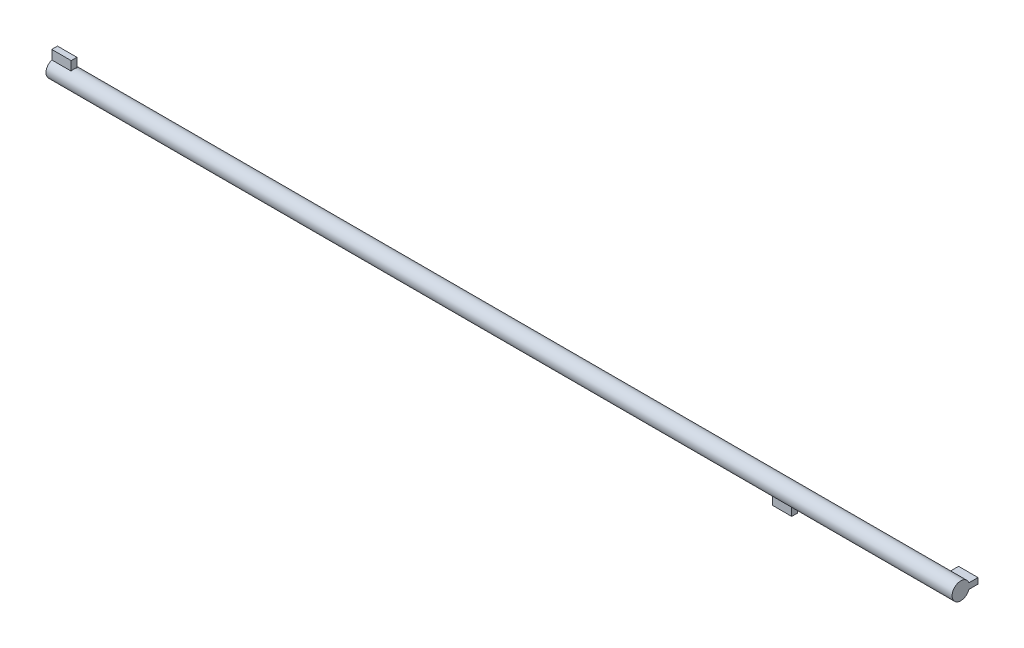
ISO-10303-21;
HEADER;
FILE_DESCRIPTION(('STEP AP214'),'2;1');
FILE_NAME('part.step','',(''),(''),'','','');
FILE_SCHEMA(('AUTOMOTIVE_DESIGN { 1 0 10303 214 1 1 1 1 }'));
ENDSEC;
DATA;
#1=APPLICATION_CONTEXT('core data for automotive mechanical design processes');
#2=APPLICATION_PROTOCOL_DEFINITION('international standard','automotive_design',2000,#1);
#3=PRODUCT_CONTEXT('',#1,'mechanical');
#4=PRODUCT('Part','Part','',(#3));
#5=PRODUCT_RELATED_PRODUCT_CATEGORY('part','',(#4));
#6=PRODUCT_DEFINITION_FORMATION('','',#4);
#7=PRODUCT_DEFINITION_CONTEXT('part definition',#1,'design');
#8=PRODUCT_DEFINITION('design','',#6,#7);
#9=PRODUCT_DEFINITION_SHAPE('','',#8);
#10=(LENGTH_UNIT() NAMED_UNIT(*) SI_UNIT(.MILLI.,.METRE.));
#11=(NAMED_UNIT(*) PLANE_ANGLE_UNIT() SI_UNIT($,.RADIAN.));
#12=(NAMED_UNIT(*) SI_UNIT($,.STERADIAN.) SOLID_ANGLE_UNIT());
#13=UNCERTAINTY_MEASURE_WITH_UNIT(LENGTH_MEASURE(1.E-05),#10,'distance_accuracy_value','');
#14=(GEOMETRIC_REPRESENTATION_CONTEXT(3) GLOBAL_UNCERTAINTY_ASSIGNED_CONTEXT((#13)) GLOBAL_UNIT_ASSIGNED_CONTEXT((#10,
#11,#12)) REPRESENTATION_CONTEXT('',''));
#15=CARTESIAN_POINT('',(0.,0.,0.));
#16=DIRECTION('',(0.,0.,1.));
#17=DIRECTION('',(1.,0.,0.));
#18=AXIS2_PLACEMENT_3D('',#15,#16,#17);
#19=CARTESIAN_POINT('',(-167.,0.,0.));
#20=DIRECTION('',(1.,0.,0.));
#21=DIRECTION('',(0.,0.,-1.));
#22=AXIS2_PLACEMENT_3D('',#19,#20,#21);
#23=CYLINDRICAL_SURFACE('',#22,2.);
#24=CARTESIAN_POINT('',(4.5,0.,0.));
#25=DIRECTION('',(1.,0.,0.));
#26=DIRECTION('',(0.,0.,-1.));
#27=AXIS2_PLACEMENT_3D('',#24,#25,#26);
#28=CIRCLE('',#27,2.);
#29=CARTESIAN_POINT('',(4.5,-1.88561808316413,-0.666666666666667));
#30=VERTEX_POINT('',#29);
#31=CARTESIAN_POINT('',(4.5,-1.88561808316413,0.666666666666667));
#32=VERTEX_POINT('',#31);
#33=EDGE_CURVE('E11',#30,#32,#28,.F.);
#34=ORIENTED_EDGE('',*,*,#33,.F.);
#35=DIRECTION('',(1.,0.,0.));
#36=VECTOR('',#35,1.);
#37=CARTESIAN_POINT('',(-167.,-1.88561808316413,-0.666666666666667));
#38=LINE('',#37,#36);
#39=CARTESIAN_POINT('',(0.,-1.88561808316413,-0.666666666666667));
#40=VERTEX_POINT('',#39);
#41=EDGE_CURVE('E248',#30,#40,#38,.F.);
#42=ORIENTED_EDGE('',*,*,#41,.T.);
#43=CARTESIAN_POINT('',(0.,0.,0.));
#44=DIRECTION('',(1.,0.,0.));
#45=DIRECTION('',(0.,0.,-1.));
#46=AXIS2_PLACEMENT_3D('',#43,#44,#45);
#47=CIRCLE('',#46,2.);
#48=CARTESIAN_POINT('',(0.,-1.88561808316413,0.666666666666667));
#49=VERTEX_POINT('',#48);
#50=EDGE_CURVE('E244',#40,#49,#47,.F.);
#51=ORIENTED_EDGE('',*,*,#50,.T.);
#52=DIRECTION('',(1.,0.,0.));
#53=VECTOR('',#52,1.);
#54=CARTESIAN_POINT('',(-167.,-1.88561808316413,0.666666666666667));
#55=LINE('',#54,#53);
#56=EDGE_CURVE('E51',#49,#32,#55,.T.);
#57=ORIENTED_EDGE('',*,*,#56,.T.);
#58=EDGE_LOOP('',(#34,#42,#51,#57));
#59=FACE_BOUND('',#58,.T.);
#60=DIRECTION('',(1.,0.,0.));
#61=VECTOR('',#60,1.);
#62=CARTESIAN_POINT('',(-167.,0.666666666666667,-1.88561808316413));
#63=LINE('',#62,#61);
#64=CARTESIAN_POINT('',(38.5,0.666666666666667,-1.88561808316413));
#65=VERTEX_POINT('',#64);
#66=CARTESIAN_POINT('',(43.,0.666666666666667,-1.88561808316413));
#67=VERTEX_POINT('',#66);
#68=EDGE_CURVE('E191',#65,#67,#63,.T.);
#69=ORIENTED_EDGE('',*,*,#68,.F.);
#70=CARTESIAN_POINT('',(38.5,0.,0.));
#71=DIRECTION('',(-1.,0.,0.));
#72=DIRECTION('',(0.,0.,1.));
#73=AXIS2_PLACEMENT_3D('',#70,#71,#72);
#74=CIRCLE('',#73,2.);
#75=CARTESIAN_POINT('',(38.5,-0.666666666666667,-1.88561808316413));
#76=VERTEX_POINT('',#75);
#77=EDGE_CURVE('E241',#76,#65,#74,.F.);
#78=ORIENTED_EDGE('',*,*,#77,.F.);
#79=DIRECTION('',(1.,0.,0.));
#80=VECTOR('',#79,1.);
#81=CARTESIAN_POINT('',(-167.,-0.666666666666667,-1.88561808316413));
#82=LINE('',#81,#80);
#83=CARTESIAN_POINT('',(43.,-0.666666666666667,-1.88561808316413));
#84=VERTEX_POINT('',#83);
#85=EDGE_CURVE('E185',#84,#76,#82,.F.);
#86=ORIENTED_EDGE('',*,*,#85,.F.);
#87=CARTESIAN_POINT('',(43.,0.,0.));
#88=DIRECTION('',(1.,0.,0.));
#89=DIRECTION('',(0.,0.,-1.));
#90=AXIS2_PLACEMENT_3D('',#87,#88,#89);
#91=CIRCLE('',#90,2.);
#92=EDGE_CURVE('E231',#67,#84,#91,.T.);
#93=ORIENTED_EDGE('',*,*,#92,.F.);
#94=EDGE_LOOP('',(#69,#78,#86,#93));
#95=FACE_BOUND('',#94,.T.);
#96=DIRECTION('',(1.,0.,0.));
#97=VECTOR('',#96,1.);
#98=CARTESIAN_POINT('',(-167.,1.88561808316413,-0.666666666666666));
#99=LINE('',#98,#97);
#100=CARTESIAN_POINT('',(-162.5,1.88561808316413,-0.666666666666666));
#101=VERTEX_POINT('',#100);
#102=CARTESIAN_POINT('',(-167.,1.88561808316413,-0.666666666666666));
#103=VERTEX_POINT('',#102);
#104=EDGE_CURVE('E227',#101,#103,#99,.F.);
#105=ORIENTED_EDGE('',*,*,#104,.F.);
#106=CARTESIAN_POINT('',(-162.5,0.,0.));
#107=DIRECTION('',(1.,0.,0.));
#108=DIRECTION('',(0.,0.,-1.));
#109=AXIS2_PLACEMENT_3D('',#106,#107,#108);
#110=CIRCLE('',#109,2.);
#111=CARTESIAN_POINT('',(-162.5,1.88561808316413,0.666666666666666));
#112=VERTEX_POINT('',#111);
#113=EDGE_CURVE('E237',#112,#101,#110,.F.);
#114=ORIENTED_EDGE('',*,*,#113,.F.);
#115=DIRECTION('',(1.,0.,0.));
#116=VECTOR('',#115,1.);
#117=CARTESIAN_POINT('',(-167.,1.88561808316413,0.666666666666666));
#118=LINE('',#117,#116);
#119=CARTESIAN_POINT('',(-167.,1.88561808316413,0.666666666666666));
#120=VERTEX_POINT('',#119);
#121=EDGE_CURVE('E220',#120,#112,#118,.T.);
#122=ORIENTED_EDGE('',*,*,#121,.F.);
#123=CARTESIAN_POINT('',(-167.,0.,0.));
#124=DIRECTION('',(1.,0.,0.));
#125=DIRECTION('',(0.,0.,-1.));
#126=AXIS2_PLACEMENT_3D('',#123,#124,#125);
#127=CIRCLE('',#126,2.);
#128=EDGE_CURVE('E234',#120,#103,#127,.T.);
#129=ORIENTED_EDGE('',*,*,#128,.T.);
#130=EDGE_LOOP('',(#105,#114,#122,#129));
#131=FACE_BOUND('',#130,.T.);
#132=ADVANCED_FACE('F43',(#59,#95,#131),#23,.T.);
#133=CARTESIAN_POINT('',(-167.,0.,0.));
#134=DIRECTION('',(1.,0.,0.));
#135=DIRECTION('',(0.,0.,-1.));
#136=AXIS2_PLACEMENT_3D('',#133,#134,#135);
#137=PLANE('',#136);
#138=ORIENTED_EDGE('',*,*,#128,.F.);
#139=DIRECTION('',(0.,1.,0.));
#140=VECTOR('',#139,1.);
#141=CARTESIAN_POINT('',(-167.,0.,0.666666666666667));
#142=LINE('',#141,#140);
#143=CARTESIAN_POINT('',(-167.,4.,0.666666666666666));
#144=VERTEX_POINT('',#143);
#145=EDGE_CURVE('E211',#120,#144,#142,.T.);
#146=ORIENTED_EDGE('',*,*,#145,.T.);
#147=DIRECTION('',(0.,0.,-1.));
#148=VECTOR('',#147,1.);
#149=CARTESIAN_POINT('',(-167.,4.,-0.666666666666666));
#150=LINE('',#149,#148);
#151=CARTESIAN_POINT('',(-167.,4.,-0.666666666666666));
#152=VERTEX_POINT('',#151);
#153=EDGE_CURVE('E200',#144,#152,#150,.T.);
#154=ORIENTED_EDGE('',*,*,#153,.T.);
#155=DIRECTION('',(0.,-1.,0.));
#156=VECTOR('',#155,1.);
#157=CARTESIAN_POINT('',(-167.,0.,-0.666666666666667));
#158=LINE('',#157,#156);
#159=EDGE_CURVE('E194',#152,#103,#158,.T.);
#160=ORIENTED_EDGE('',*,*,#159,.T.);
#161=EDGE_LOOP('',(#138,#146,#154,#160));
#162=FACE_BOUND('',#161,.T.);
#163=ADVANCED_FACE('F277',(#162),#137,.F.);
#164=CARTESIAN_POINT('',(43.,0.,0.));
#165=DIRECTION('',(1.,0.,0.));
#166=DIRECTION('',(0.,0.,-1.));
#167=AXIS2_PLACEMENT_3D('',#164,#165,#166);
#168=PLANE('',#167);
#169=ORIENTED_EDGE('',*,*,#92,.T.);
#170=DIRECTION('',(0.,0.,-1.));
#171=VECTOR('',#170,1.);
#172=CARTESIAN_POINT('',(43.,-0.666666666666667,0.));
#173=LINE('',#172,#171);
#174=CARTESIAN_POINT('',(43.,-0.666666666666668,-4.));
#175=VERTEX_POINT('',#174);
#176=EDGE_CURVE('E160',#84,#175,#173,.T.);
#177=ORIENTED_EDGE('',*,*,#176,.T.);
#178=DIRECTION('',(0.,1.,0.));
#179=VECTOR('',#178,1.);
#180=CARTESIAN_POINT('',(43.,0.666666666666668,-4.));
#181=LINE('',#180,#179);
#182=CARTESIAN_POINT('',(43.,0.666666666666668,-4.));
#183=VERTEX_POINT('',#182);
#184=EDGE_CURVE('E170',#175,#183,#181,.T.);
#185=ORIENTED_EDGE('',*,*,#184,.T.);
#186=DIRECTION('',(0.,0.,1.));
#187=VECTOR('',#186,1.);
#188=CARTESIAN_POINT('',(43.,0.666666666666667,0.));
#189=LINE('',#188,#187);
#190=EDGE_CURVE('E66',#183,#67,#189,.T.);
#191=ORIENTED_EDGE('',*,*,#190,.T.);
#192=EDGE_LOOP('',(#169,#177,#185,#191));
#193=FACE_BOUND('',#192,.T.);
#194=ADVANCED_FACE('F281',(#193),#168,.T.);
#195=CARTESIAN_POINT('',(-162.5,0.,-0.666666666666667));
#196=DIRECTION('',(0.,0.,-1.));
#197=DIRECTION('',(0.,1.,0.));
#198=AXIS2_PLACEMENT_3D('',#195,#196,#197);
#199=PLANE('',#198);
#200=DIRECTION('',(0.,-1.,0.));
#201=VECTOR('',#200,1.);
#202=CARTESIAN_POINT('',(-162.5,0.,-0.666666666666667));
#203=LINE('',#202,#201);
#204=CARTESIAN_POINT('',(-162.5,4.,-0.666666666666666));
#205=VERTEX_POINT('',#204);
#206=EDGE_CURVE('E195',#205,#101,#203,.T.);
#207=ORIENTED_EDGE('',*,*,#206,.T.);
#208=ORIENTED_EDGE('',*,*,#104,.T.);
#209=ORIENTED_EDGE('',*,*,#159,.F.);
#210=DIRECTION('',(-1.,0.,0.));
#211=VECTOR('',#210,1.);
#212=CARTESIAN_POINT('',(-162.5,4.,-0.666666666666666));
#213=LINE('',#212,#211);
#214=EDGE_CURVE('E217',#205,#152,#213,.T.);
#215=ORIENTED_EDGE('',*,*,#214,.F.);
#216=EDGE_LOOP('',(#207,#208,#209,#215));
#217=FACE_BOUND('',#216,.T.);
#218=ADVANCED_FACE('F286',(#217),#199,.T.);
#219=CARTESIAN_POINT('',(-162.5,4.,-0.666666666666666));
#220=DIRECTION('',(0.,1.,0.));
#221=DIRECTION('',(0.,0.,1.));
#222=AXIS2_PLACEMENT_3D('',#219,#220,#221);
#223=PLANE('',#222);
#224=ORIENTED_EDGE('',*,*,#153,.F.);
#225=DIRECTION('',(-1.,0.,0.));
#226=VECTOR('',#225,1.);
#227=CARTESIAN_POINT('',(-162.5,4.,0.666666666666666));
#228=LINE('',#227,#226);
#229=CARTESIAN_POINT('',(-162.5,4.,0.666666666666666));
#230=VERTEX_POINT('',#229);
#231=EDGE_CURVE('E207',#230,#144,#228,.T.);
#232=ORIENTED_EDGE('',*,*,#231,.F.);
#233=DIRECTION('',(0.,0.,-1.));
#234=VECTOR('',#233,1.);
#235=CARTESIAN_POINT('',(-162.5,4.,-0.666666666666666));
#236=LINE('',#235,#234);
#237=EDGE_CURVE('E203',#230,#205,#236,.T.);
#238=ORIENTED_EDGE('',*,*,#237,.T.);
#239=ORIENTED_EDGE('',*,*,#214,.T.);
#240=EDGE_LOOP('',(#224,#232,#238,#239));
#241=FACE_BOUND('',#240,.T.);
#242=ADVANCED_FACE('F291',(#241),#223,.T.);
#243=CARTESIAN_POINT('',(-162.5,0.,0.666666666666667));
#244=DIRECTION('',(0.,0.,1.));
#245=DIRECTION('',(0.,-1.,0.));
#246=AXIS2_PLACEMENT_3D('',#243,#244,#245);
#247=PLANE('',#246);
#248=ORIENTED_EDGE('',*,*,#145,.F.);
#249=ORIENTED_EDGE('',*,*,#121,.T.);
#250=DIRECTION('',(0.,1.,0.));
#251=VECTOR('',#250,1.);
#252=CARTESIAN_POINT('',(-162.5,0.,0.666666666666667));
#253=LINE('',#252,#251);
#254=EDGE_CURVE('E199',#112,#230,#253,.T.);
#255=ORIENTED_EDGE('',*,*,#254,.T.);
#256=ORIENTED_EDGE('',*,*,#231,.T.);
#257=EDGE_LOOP('',(#248,#249,#255,#256));
#258=FACE_BOUND('',#257,.T.);
#259=ADVANCED_FACE('F293',(#258),#247,.T.);
#260=CARTESIAN_POINT('',(-162.5,0.,0.));
#261=DIRECTION('',(1.,0.,0.));
#262=DIRECTION('',(0.,0.,-1.));
#263=AXIS2_PLACEMENT_3D('',#260,#261,#262);
#264=PLANE('',#263);
#265=ORIENTED_EDGE('',*,*,#254,.F.);
#266=ORIENTED_EDGE('',*,*,#113,.T.);
#267=ORIENTED_EDGE('',*,*,#206,.F.);
#268=ORIENTED_EDGE('',*,*,#237,.F.);
#269=EDGE_LOOP('',(#265,#266,#267,#268));
#270=FACE_BOUND('',#269,.T.);
#271=ADVANCED_FACE('F296',(#270),#264,.T.);
#272=CARTESIAN_POINT('',(38.5,0.666666666666667,0.));
#273=DIRECTION('',(0.,1.,0.));
#274=DIRECTION('',(0.,0.,1.));
#275=AXIS2_PLACEMENT_3D('',#272,#273,#274);
#276=PLANE('',#275);
#277=DIRECTION('',(0.,0.,1.));
#278=VECTOR('',#277,1.);
#279=CARTESIAN_POINT('',(38.5,0.666666666666667,0.));
#280=LINE('',#279,#278);
#281=CARTESIAN_POINT('',(38.5,0.666666666666668,-4.));
#282=VERTEX_POINT('',#281);
#283=EDGE_CURVE('E165',#282,#65,#280,.T.);
#284=ORIENTED_EDGE('',*,*,#283,.T.);
#285=ORIENTED_EDGE('',*,*,#68,.T.);
#286=ORIENTED_EDGE('',*,*,#190,.F.);
#287=DIRECTION('',(1.,0.,0.));
#288=VECTOR('',#287,1.);
#289=CARTESIAN_POINT('',(38.5,0.666666666666668,-4.));
#290=LINE('',#289,#288);
#291=EDGE_CURVE('E182',#282,#183,#290,.T.);
#292=ORIENTED_EDGE('',*,*,#291,.F.);
#293=EDGE_LOOP('',(#284,#285,#286,#292));
#294=FACE_BOUND('',#293,.T.);
#295=ADVANCED_FACE('F303',(#294),#276,.T.);
#296=CARTESIAN_POINT('',(38.5,0.666666666666668,-4.));
#297=DIRECTION('',(0.,0.,-1.));
#298=DIRECTION('',(-1.,0.,0.));
#299=AXIS2_PLACEMENT_3D('',#296,#297,#298);
#300=PLANE('',#299);
#301=ORIENTED_EDGE('',*,*,#184,.F.);
#302=DIRECTION('',(1.,0.,0.));
#303=VECTOR('',#302,1.);
#304=CARTESIAN_POINT('',(38.5,-0.666666666666668,-4.));
#305=LINE('',#304,#303);
#306=CARTESIAN_POINT('',(38.5,-0.666666666666668,-4.));
#307=VERTEX_POINT('',#306);
#308=EDGE_CURVE('E176',#307,#175,#305,.T.);
#309=ORIENTED_EDGE('',*,*,#308,.F.);
#310=DIRECTION('',(0.,1.,0.));
#311=VECTOR('',#310,1.);
#312=CARTESIAN_POINT('',(38.5,0.666666666666668,-4.));
#313=LINE('',#312,#311);
#314=EDGE_CURVE('E173',#307,#282,#313,.T.);
#315=ORIENTED_EDGE('',*,*,#314,.T.);
#316=ORIENTED_EDGE('',*,*,#291,.T.);
#317=EDGE_LOOP('',(#301,#309,#315,#316));
#318=FACE_BOUND('',#317,.T.);
#319=ADVANCED_FACE('F307',(#318),#300,.T.);
#320=CARTESIAN_POINT('',(38.5,-0.666666666666667,0.));
#321=DIRECTION('',(0.,-1.,0.));
#322=DIRECTION('',(0.,0.,-1.));
#323=AXIS2_PLACEMENT_3D('',#320,#321,#322);
#324=PLANE('',#323);
#325=ORIENTED_EDGE('',*,*,#176,.F.);
#326=ORIENTED_EDGE('',*,*,#85,.T.);
#327=DIRECTION('',(0.,0.,-1.));
#328=VECTOR('',#327,1.);
#329=CARTESIAN_POINT('',(38.5,-0.666666666666667,0.));
#330=LINE('',#329,#328);
#331=EDGE_CURVE('E169',#76,#307,#330,.T.);
#332=ORIENTED_EDGE('',*,*,#331,.T.);
#333=ORIENTED_EDGE('',*,*,#308,.T.);
#334=EDGE_LOOP('',(#325,#326,#332,#333));
#335=FACE_BOUND('',#334,.T.);
#336=ADVANCED_FACE('F309',(#335),#324,.T.);
#337=CARTESIAN_POINT('',(38.5,0.,0.));
#338=DIRECTION('',(-1.,0.,0.));
#339=DIRECTION('',(0.,0.,1.));
#340=AXIS2_PLACEMENT_3D('',#337,#338,#339);
#341=PLANE('',#340);
#342=ORIENTED_EDGE('',*,*,#331,.F.);
#343=ORIENTED_EDGE('',*,*,#77,.T.);
#344=ORIENTED_EDGE('',*,*,#283,.F.);
#345=ORIENTED_EDGE('',*,*,#314,.F.);
#346=EDGE_LOOP('',(#342,#343,#344,#345));
#347=FACE_BOUND('',#346,.T.);
#348=ADVANCED_FACE('F312',(#347),#341,.T.);
#349=CARTESIAN_POINT('',(4.5,0.,0.666666666666667));
#350=DIRECTION('',(0.,0.,-1.));
#351=DIRECTION('',(0.,1.,0.));
#352=AXIS2_PLACEMENT_3D('',#349,#350,#351);
#353=PLANE('',#352);
#354=ORIENTED_EDGE('',*,*,#56,.F.);
#355=DIRECTION('',(0.,-1.,0.));
#356=VECTOR('',#355,1.);
#357=CARTESIAN_POINT('',(0.,0.,0.666666666666667));
#358=LINE('',#357,#356);
#359=CARTESIAN_POINT('',(0.,-4.,0.666666666666667));
#360=VERTEX_POINT('',#359);
#361=EDGE_CURVE('E58',#49,#360,#358,.T.);
#362=ORIENTED_EDGE('',*,*,#361,.T.);
#363=DIRECTION('',(-1.,0.,0.));
#364=VECTOR('',#363,1.);
#365=CARTESIAN_POINT('',(4.5,-4.,0.666666666666667));
#366=LINE('',#365,#364);
#367=CARTESIAN_POINT('',(4.5,-4.,0.666666666666667));
#368=VERTEX_POINT('',#367);
#369=EDGE_CURVE('E148',#368,#360,#366,.T.);
#370=ORIENTED_EDGE('',*,*,#369,.F.);
#371=DIRECTION('',(0.,-1.,0.));
#372=VECTOR('',#371,1.);
#373=CARTESIAN_POINT('',(4.5,0.,0.666666666666667));
#374=LINE('',#373,#372);
#375=EDGE_CURVE('E132',#32,#368,#374,.T.);
#376=ORIENTED_EDGE('',*,*,#375,.F.);
#377=EDGE_LOOP('',(#354,#362,#370,#376));
#378=FACE_BOUND('',#377,.T.);
#379=ADVANCED_FACE('F155',(#378),#353,.F.);
#380=CARTESIAN_POINT('',(4.5,-4.,0.666666666666667));
#381=DIRECTION('',(0.,1.,0.));
#382=DIRECTION('',(0.,0.,1.));
#383=AXIS2_PLACEMENT_3D('',#380,#381,#382);
#384=PLANE('',#383);
#385=DIRECTION('',(0.,0.,-1.));
#386=VECTOR('',#385,1.);
#387=CARTESIAN_POINT('',(0.,-4.,0.666666666666667));
#388=LINE('',#387,#386);
#389=CARTESIAN_POINT('',(0.,-4.,-0.666666666666667));
#390=VERTEX_POINT('',#389);
#391=EDGE_CURVE('E260',#360,#390,#388,.T.);
#392=ORIENTED_EDGE('',*,*,#391,.T.);
#393=DIRECTION('',(-1.,0.,0.));
#394=VECTOR('',#393,1.);
#395=CARTESIAN_POINT('',(4.5,-4.,-0.666666666666667));
#396=LINE('',#395,#394);
#397=CARTESIAN_POINT('',(4.5,-4.,-0.666666666666667));
#398=VERTEX_POINT('',#397);
#399=EDGE_CURVE('E150',#398,#390,#396,.T.);
#400=ORIENTED_EDGE('',*,*,#399,.F.);
#401=DIRECTION('',(0.,0.,-1.));
#402=VECTOR('',#401,1.);
#403=CARTESIAN_POINT('',(4.5,-4.,0.666666666666667));
#404=LINE('',#403,#402);
#405=EDGE_CURVE('E136',#368,#398,#404,.T.);
#406=ORIENTED_EDGE('',*,*,#405,.F.);
#407=ORIENTED_EDGE('',*,*,#369,.T.);
#408=EDGE_LOOP('',(#392,#400,#406,#407));
#409=FACE_BOUND('',#408,.T.);
#410=ADVANCED_FACE('F147',(#409),#384,.F.);
#411=CARTESIAN_POINT('',(4.5,0.,-0.666666666666667));
#412=DIRECTION('',(0.,0.,1.));
#413=DIRECTION('',(0.,-1.,0.));
#414=AXIS2_PLACEMENT_3D('',#411,#412,#413);
#415=PLANE('',#414);
#416=ORIENTED_EDGE('',*,*,#41,.F.);
#417=DIRECTION('',(0.,1.,0.));
#418=VECTOR('',#417,1.);
#419=CARTESIAN_POINT('',(4.5,0.,-0.666666666666667));
#420=LINE('',#419,#418);
#421=EDGE_CURVE('E153',#398,#30,#420,.T.);
#422=ORIENTED_EDGE('',*,*,#421,.F.);
#423=ORIENTED_EDGE('',*,*,#399,.T.);
#424=DIRECTION('',(0.,1.,0.));
#425=VECTOR('',#424,1.);
#426=CARTESIAN_POINT('',(0.,0.,-0.666666666666667));
#427=LINE('',#426,#425);
#428=EDGE_CURVE('E143',#390,#40,#427,.T.);
#429=ORIENTED_EDGE('',*,*,#428,.T.);
#430=EDGE_LOOP('',(#416,#422,#423,#429));
#431=FACE_BOUND('',#430,.T.);
#432=ADVANCED_FACE('F258',(#431),#415,.F.);
#433=CARTESIAN_POINT('',(4.5,0.,0.));
#434=DIRECTION('',(1.,0.,0.));
#435=DIRECTION('',(0.,0.,-1.));
#436=AXIS2_PLACEMENT_3D('',#433,#434,#435);
#437=PLANE('',#436);
#438=ORIENTED_EDGE('',*,*,#421,.T.);
#439=ORIENTED_EDGE('',*,*,#33,.T.);
#440=ORIENTED_EDGE('',*,*,#375,.T.);
#441=ORIENTED_EDGE('',*,*,#405,.T.);
#442=EDGE_LOOP('',(#438,#439,#440,#441));
#443=FACE_BOUND('',#442,.T.);
#444=ADVANCED_FACE('F135',(#443),#437,.T.);
#445=CARTESIAN_POINT('',(0.,0.,0.));
#446=DIRECTION('',(1.,0.,0.));
#447=DIRECTION('',(0.,0.,-1.));
#448=AXIS2_PLACEMENT_3D('',#445,#446,#447);
#449=PLANE('',#448);
#450=ORIENTED_EDGE('',*,*,#50,.F.);
#451=ORIENTED_EDGE('',*,*,#428,.F.);
#452=ORIENTED_EDGE('',*,*,#391,.F.);
#453=ORIENTED_EDGE('',*,*,#361,.F.);
#454=EDGE_LOOP('',(#450,#451,#452,#453));
#455=FACE_BOUND('',#454,.T.);
#456=ADVANCED_FACE('F256',(#455),#449,.F.);
#457=CLOSED_SHELL('',(#132,#163,#194,#218,#242,#259,#271,#295,#319,#336,#348,#379,#410,#432,
#444,#456));
#458=MANIFOLD_SOLID_BREP('B2',#457);
#459=ADVANCED_BREP_SHAPE_REPRESENTATION('',(#18,#458),#14);
#460=SHAPE_DEFINITION_REPRESENTATION(#9,#459);
ENDSEC;
END-ISO-10303-21;
